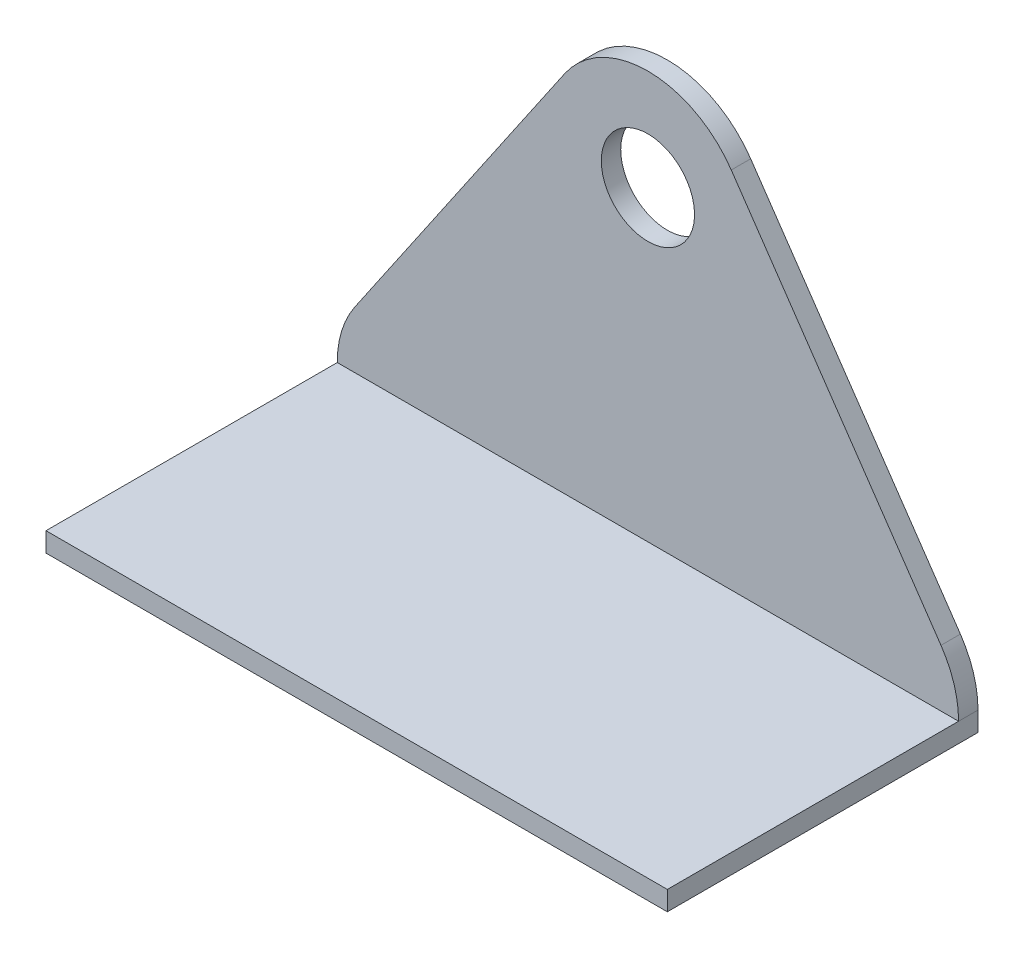
ISO-10303-21;
HEADER;
FILE_DESCRIPTION(('STEP AP214'),'2;1');
FILE_NAME('part.step','',(''),(''),'','','');
FILE_SCHEMA(('AUTOMOTIVE_DESIGN { 1 0 10303 214 1 1 1 1 }'));
ENDSEC;
DATA;
#1=APPLICATION_CONTEXT('core data for automotive mechanical design processes');
#2=APPLICATION_PROTOCOL_DEFINITION('international standard','automotive_design',2000,#1);
#3=PRODUCT_CONTEXT('',#1,'mechanical');
#4=PRODUCT('Part','Part','',(#3));
#5=PRODUCT_RELATED_PRODUCT_CATEGORY('part','',(#4));
#6=PRODUCT_DEFINITION_FORMATION('','',#4);
#7=PRODUCT_DEFINITION_CONTEXT('part definition',#1,'design');
#8=PRODUCT_DEFINITION('design','',#6,#7);
#9=PRODUCT_DEFINITION_SHAPE('','',#8);
#10=(LENGTH_UNIT() NAMED_UNIT(*) SI_UNIT(.MILLI.,.METRE.));
#11=(NAMED_UNIT(*) PLANE_ANGLE_UNIT() SI_UNIT($,.RADIAN.));
#12=(NAMED_UNIT(*) SI_UNIT($,.STERADIAN.) SOLID_ANGLE_UNIT());
#13=UNCERTAINTY_MEASURE_WITH_UNIT(LENGTH_MEASURE(1.E-05),#10,'distance_accuracy_value','');
#14=(GEOMETRIC_REPRESENTATION_CONTEXT(3) GLOBAL_UNCERTAINTY_ASSIGNED_CONTEXT((#13)) GLOBAL_UNIT_ASSIGNED_CONTEXT((#10,
#11,#12)) REPRESENTATION_CONTEXT('',''));
#15=CARTESIAN_POINT('',(0.,0.,0.));
#16=DIRECTION('',(0.,0.,1.));
#17=DIRECTION('',(1.,0.,0.));
#18=AXIS2_PLACEMENT_3D('',#15,#16,#17);
#19=CARTESIAN_POINT('',(0.,2.5,-40.));
#20=DIRECTION('',(0.,-1.,0.));
#21=DIRECTION('',(0.,0.,-1.));
#22=AXIS2_PLACEMENT_3D('',#19,#20,#21);
#23=PLANE('',#22);
#24=DIRECTION('',(1.,0.,0.));
#25=VECTOR('',#24,1.);
#26=CARTESIAN_POINT('',(-44.5033848530159,2.5,-37.5));
#27=LINE('',#26,#25);
#28=CARTESIAN_POINT('',(0.,2.5,-37.5));
#29=VERTEX_POINT('',#28);
#30=CARTESIAN_POINT('',(80.,2.5,-37.5));
#31=VERTEX_POINT('',#30);
#32=EDGE_CURVE('E59',#29,#31,#27,.T.);
#33=ORIENTED_EDGE('',*,*,#32,.F.);
#34=DIRECTION('',(0.,0.,1.));
#35=VECTOR('',#34,1.);
#36=CARTESIAN_POINT('',(0.,2.5,0.));
#37=LINE('',#36,#35);
#38=CARTESIAN_POINT('',(0.,2.5,0.));
#39=VERTEX_POINT('',#38);
#40=EDGE_CURVE('E93',#29,#39,#37,.T.);
#41=ORIENTED_EDGE('',*,*,#40,.T.);
#42=DIRECTION('',(1.,0.,0.));
#43=VECTOR('',#42,1.);
#44=CARTESIAN_POINT('',(0.,2.5,0.));
#45=LINE('',#44,#43);
#46=CARTESIAN_POINT('',(80.,2.5,0.));
#47=VERTEX_POINT('',#46);
#48=EDGE_CURVE('E201',#39,#47,#45,.T.);
#49=ORIENTED_EDGE('',*,*,#48,.T.);
#50=DIRECTION('',(0.,0.,-1.));
#51=VECTOR('',#50,1.);
#52=CARTESIAN_POINT('',(80.,2.5,0.));
#53=LINE('',#52,#51);
#54=EDGE_CURVE('E208',#47,#31,#53,.T.);
#55=ORIENTED_EDGE('',*,*,#54,.T.);
#56=EDGE_LOOP('',(#33,#41,#49,#55));
#57=FACE_BOUND('',#56,.T.);
#58=ADVANCED_FACE('F39',(#57),#23,.F.);
#59=CARTESIAN_POINT('',(0.,2.5,0.));
#60=DIRECTION('',(1.,0.,0.));
#61=DIRECTION('',(0.,0.,-1.));
#62=AXIS2_PLACEMENT_3D('',#59,#60,#61);
#63=PLANE('',#62);
#64=DIRECTION('',(0.,0.,1.));
#65=VECTOR('',#64,1.);
#66=CARTESIAN_POINT('',(0.,0.,0.));
#67=LINE('',#66,#65);
#68=CARTESIAN_POINT('',(0.,0.,-40.));
#69=VERTEX_POINT('',#68);
#70=CARTESIAN_POINT('',(0.,0.,0.));
#71=VERTEX_POINT('',#70);
#72=EDGE_CURVE('E162',#69,#71,#67,.T.);
#73=ORIENTED_EDGE('',*,*,#72,.T.);
#74=DIRECTION('',(0.,-1.,0.));
#75=VECTOR('',#74,1.);
#76=CARTESIAN_POINT('',(0.,2.5,0.));
#77=LINE('',#76,#75);
#78=EDGE_CURVE('E11',#39,#71,#77,.T.);
#79=ORIENTED_EDGE('',*,*,#78,.F.);
#80=ORIENTED_EDGE('',*,*,#40,.F.);
#81=CARTESIAN_POINT('',(0.,2.5,-40.));
#82=VERTEX_POINT('',#81);
#83=EDGE_CURVE('E151',#82,#29,#37,.T.);
#84=ORIENTED_EDGE('',*,*,#83,.F.);
#85=DIRECTION('',(0.,-1.,0.));
#86=VECTOR('',#85,1.);
#87=CARTESIAN_POINT('',(0.,2.5,-40.));
#88=LINE('',#87,#86);
#89=EDGE_CURVE('E69',#82,#69,#88,.T.);
#90=ORIENTED_EDGE('',*,*,#89,.T.);
#91=EDGE_LOOP('',(#73,#79,#80,#84,#90));
#92=FACE_BOUND('',#91,.T.);
#93=ADVANCED_FACE('F41',(#92),#63,.F.);
#94=CARTESIAN_POINT('',(0.,2.5,0.));
#95=DIRECTION('',(0.,0.,-1.));
#96=DIRECTION('',(-1.,0.,0.));
#97=AXIS2_PLACEMENT_3D('',#94,#95,#96);
#98=PLANE('',#97);
#99=DIRECTION('',(1.,0.,0.));
#100=VECTOR('',#99,1.);
#101=CARTESIAN_POINT('',(0.,0.,0.));
#102=LINE('',#101,#100);
#103=CARTESIAN_POINT('',(80.,0.,0.));
#104=VERTEX_POINT('',#103);
#105=EDGE_CURVE('E214',#71,#104,#102,.T.);
#106=ORIENTED_EDGE('',*,*,#105,.T.);
#107=DIRECTION('',(0.,-1.,0.));
#108=VECTOR('',#107,1.);
#109=CARTESIAN_POINT('',(80.,2.5,0.));
#110=LINE('',#109,#108);
#111=EDGE_CURVE('E48',#47,#104,#110,.T.);
#112=ORIENTED_EDGE('',*,*,#111,.F.);
#113=ORIENTED_EDGE('',*,*,#48,.F.);
#114=ORIENTED_EDGE('',*,*,#78,.T.);
#115=EDGE_LOOP('',(#106,#112,#113,#114));
#116=FACE_BOUND('',#115,.T.);
#117=ADVANCED_FACE('F264',(#116),#98,.F.);
#118=CARTESIAN_POINT('',(80.,2.5,0.));
#119=DIRECTION('',(-1.,0.,0.));
#120=DIRECTION('',(0.,0.,1.));
#121=AXIS2_PLACEMENT_3D('',#118,#119,#120);
#122=PLANE('',#121);
#123=DIRECTION('',(0.,0.,-1.));
#124=VECTOR('',#123,1.);
#125=CARTESIAN_POINT('',(80.,0.,0.));
#126=LINE('',#125,#124);
#127=CARTESIAN_POINT('',(80.,0.,-40.));
#128=VERTEX_POINT('',#127);
#129=EDGE_CURVE('E216',#104,#128,#126,.T.);
#130=ORIENTED_EDGE('',*,*,#129,.T.);
#131=DIRECTION('',(0.,-1.,0.));
#132=VECTOR('',#131,1.);
#133=CARTESIAN_POINT('',(80.,2.5,-40.));
#134=LINE('',#133,#132);
#135=CARTESIAN_POINT('',(80.,2.5,-40.));
#136=VERTEX_POINT('',#135);
#137=EDGE_CURVE('E220',#136,#128,#134,.T.);
#138=ORIENTED_EDGE('',*,*,#137,.F.);
#139=DIRECTION('',(0.,0.,-1.));
#140=VECTOR('',#139,1.);
#141=CARTESIAN_POINT('',(80.,2.5,-37.5));
#142=LINE('',#141,#140);
#143=EDGE_CURVE('E160',#31,#136,#142,.T.);
#144=ORIENTED_EDGE('',*,*,#143,.F.);
#145=ORIENTED_EDGE('',*,*,#54,.F.);
#146=ORIENTED_EDGE('',*,*,#111,.T.);
#147=EDGE_LOOP('',(#130,#138,#144,#145,#146));
#148=FACE_BOUND('',#147,.T.);
#149=ADVANCED_FACE('F227',(#148),#122,.F.);
#150=CARTESIAN_POINT('',(0.,2.5,-40.));
#151=DIRECTION('',(0.,0.,1.));
#152=DIRECTION('',(1.,0.,0.));
#153=AXIS2_PLACEMENT_3D('',#150,#151,#152);
#154=PLANE('',#153);
#155=DIRECTION('',(-1.,0.,0.));
#156=VECTOR('',#155,1.);
#157=CARTESIAN_POINT('',(0.,0.,-40.));
#158=LINE('',#157,#156);
#159=EDGE_CURVE('E90',#128,#69,#158,.T.);
#160=ORIENTED_EDGE('',*,*,#159,.T.);
#161=ORIENTED_EDGE('',*,*,#89,.F.);
#162=CARTESIAN_POINT('',(13.,2.5,-40.));
#163=DIRECTION('',(0.,0.,-1.));
#164=DIRECTION('',(-1.,0.,0.));
#165=AXIS2_PLACEMENT_3D('',#162,#163,#164);
#166=CIRCLE('',#165,13.);
#167=CARTESIAN_POINT('',(2.26767448479644,9.83601997241763,-40.));
#168=VERTEX_POINT('',#167);
#169=EDGE_CURVE('E179',#82,#168,#166,.T.);
#170=ORIENTED_EDGE('',*,*,#169,.T.);
#171=DIRECTION('',(0.56430922864751,0.825563501169506,0.));
#172=VECTOR('',#171,1.);
#173=CARTESIAN_POINT('',(-11.5455002916758,-10.3721431264954,-40.));
#174=LINE('',#173,#172);
#175=CARTESIAN_POINT('',(29.2676744847964,49.3360199724176,-40.));
#176=VERTEX_POINT('',#175);
#177=EDGE_CURVE('E132',#168,#176,#174,.T.);
#178=ORIENTED_EDGE('',*,*,#177,.T.);
#179=CARTESIAN_POINT('',(40.,42.,-40.));
#180=DIRECTION('',(0.,0.,-1.));
#181=DIRECTION('',(-1.,0.,0.));
#182=AXIS2_PLACEMENT_3D('',#179,#180,#181);
#183=CIRCLE('',#182,13.);
#184=CARTESIAN_POINT('',(50.7323255152036,49.3360199724176,-40.));
#185=VERTEX_POINT('',#184);
#186=EDGE_CURVE('E183',#185,#176,#183,.F.);
#187=ORIENTED_EDGE('',*,*,#186,.F.);
#188=DIRECTION('',(-0.56430922864751,0.825563501169506,0.));
#189=VECTOR('',#188,1.);
#190=CARTESIAN_POINT('',(37.7261554775676,68.3635650274776,-40.));
#191=LINE('',#190,#189);
#192=CARTESIAN_POINT('',(77.7323255152036,9.83601997241763,-40.));
#193=VERTEX_POINT('',#192);
#194=EDGE_CURVE('E187',#193,#185,#191,.T.);
#195=ORIENTED_EDGE('',*,*,#194,.F.);
#196=CARTESIAN_POINT('',(67.,2.5,-40.));
#197=DIRECTION('',(0.,0.,-1.));
#198=DIRECTION('',(-1.,0.,0.));
#199=AXIS2_PLACEMENT_3D('',#196,#197,#198);
#200=CIRCLE('',#199,13.);
#201=EDGE_CURVE('E189',#136,#193,#200,.F.);
#202=ORIENTED_EDGE('',*,*,#201,.F.);
#203=ORIENTED_EDGE('',*,*,#137,.T.);
#204=EDGE_LOOP('',(#160,#161,#170,#178,#187,#195,#202,#203));
#205=FACE_BOUND('',#204,.T.);
#206=CARTESIAN_POINT('',(40.,42.,-40.));
#207=DIRECTION('',(0.,0.,-1.));
#208=DIRECTION('',(-1.,0.,0.));
#209=AXIS2_PLACEMENT_3D('',#206,#207,#208);
#210=CIRCLE('',#209,5.99999999999999);
#211=CARTESIAN_POINT('',(34.,42.,-40.));
#212=VERTEX_POINT('',#211);
#213=EDGE_CURVE('E175',#212,#212,#210,.T.);
#214=ORIENTED_EDGE('',*,*,#213,.F.);
#215=EDGE_LOOP('',(#214));
#216=FACE_BOUND('',#215,.T.);
#217=ADVANCED_FACE('F235',(#205,#216),#154,.F.);
#218=CARTESIAN_POINT('',(0.,0.,-40.));
#219=DIRECTION('',(0.,-1.,0.));
#220=DIRECTION('',(0.,0.,-1.));
#221=AXIS2_PLACEMENT_3D('',#218,#219,#220);
#222=PLANE('',#221);
#223=ORIENTED_EDGE('',*,*,#72,.F.);
#224=ORIENTED_EDGE('',*,*,#159,.F.);
#225=ORIENTED_EDGE('',*,*,#129,.F.);
#226=ORIENTED_EDGE('',*,*,#105,.F.);
#227=EDGE_LOOP('',(#223,#224,#225,#226));
#228=FACE_BOUND('',#227,.T.);
#229=ADVANCED_FACE('F232',(#228),#222,.T.);
#230=CARTESIAN_POINT('',(67.,2.5,-37.5));
#231=DIRECTION('',(0.,0.,-1.));
#232=DIRECTION('',(-1.,0.,0.));
#233=AXIS2_PLACEMENT_3D('',#230,#231,#232);
#234=CYLINDRICAL_SURFACE('',#233,13.);
#235=ORIENTED_EDGE('',*,*,#201,.T.);
#236=DIRECTION('',(0.,0.,-1.));
#237=VECTOR('',#236,1.);
#238=CARTESIAN_POINT('',(77.7323255152036,9.83601997241763,-37.5));
#239=LINE('',#238,#237);
#240=CARTESIAN_POINT('',(77.7323255152036,9.83601997241763,-37.5));
#241=VERTEX_POINT('',#240);
#242=EDGE_CURVE('E163',#241,#193,#239,.T.);
#243=ORIENTED_EDGE('',*,*,#242,.F.);
#244=CARTESIAN_POINT('',(67.,2.5,-37.5));
#245=DIRECTION('',(0.,0.,-1.));
#246=DIRECTION('',(-1.,0.,0.));
#247=AXIS2_PLACEMENT_3D('',#244,#245,#246);
#248=CIRCLE('',#247,13.);
#249=EDGE_CURVE('E138',#31,#241,#248,.F.);
#250=ORIENTED_EDGE('',*,*,#249,.F.);
#251=ORIENTED_EDGE('',*,*,#143,.T.);
#252=EDGE_LOOP('',(#235,#243,#250,#251));
#253=FACE_BOUND('',#252,.T.);
#254=ADVANCED_FACE('F249',(#253),#234,.T.);
#255=CARTESIAN_POINT('',(37.7261554775676,68.3635650274776,-37.5));
#256=DIRECTION('',(-0.825563501169506,-0.56430922864751,0.));
#257=DIRECTION('',(0.56430922864751,-0.825563501169506,0.));
#258=AXIS2_PLACEMENT_3D('',#255,#256,#257);
#259=PLANE('',#258);
#260=ORIENTED_EDGE('',*,*,#194,.T.);
#261=DIRECTION('',(0.,0.,-1.));
#262=VECTOR('',#261,1.);
#263=CARTESIAN_POINT('',(50.7323255152036,49.3360199724176,-37.5));
#264=LINE('',#263,#262);
#265=CARTESIAN_POINT('',(50.7323255152036,49.3360199724176,-37.5));
#266=VERTEX_POINT('',#265);
#267=EDGE_CURVE('E193',#266,#185,#264,.T.);
#268=ORIENTED_EDGE('',*,*,#267,.F.);
#269=DIRECTION('',(-0.56430922864751,0.825563501169506,0.));
#270=VECTOR('',#269,1.);
#271=CARTESIAN_POINT('',(37.7261554775676,68.3635650274776,-37.5));
#272=LINE('',#271,#270);
#273=EDGE_CURVE('E173',#241,#266,#272,.T.);
#274=ORIENTED_EDGE('',*,*,#273,.F.);
#275=ORIENTED_EDGE('',*,*,#242,.T.);
#276=EDGE_LOOP('',(#260,#268,#274,#275));
#277=FACE_BOUND('',#276,.T.);
#278=ADVANCED_FACE('F245',(#277),#259,.F.);
#279=CARTESIAN_POINT('',(40.,42.,-37.5));
#280=DIRECTION('',(0.,0.,-1.));
#281=DIRECTION('',(-1.,0.,0.));
#282=AXIS2_PLACEMENT_3D('',#279,#280,#281);
#283=CYLINDRICAL_SURFACE('',#282,13.);
#284=ORIENTED_EDGE('',*,*,#186,.T.);
#285=DIRECTION('',(0.,0.,-1.));
#286=VECTOR('',#285,1.);
#287=CARTESIAN_POINT('',(29.2676744847964,49.3360199724176,-37.5));
#288=LINE('',#287,#286);
#289=CARTESIAN_POINT('',(29.2676744847964,49.3360199724176,-37.5));
#290=VERTEX_POINT('',#289);
#291=EDGE_CURVE('E137',#290,#176,#288,.T.);
#292=ORIENTED_EDGE('',*,*,#291,.F.);
#293=CARTESIAN_POINT('',(40.,42.,-37.5));
#294=DIRECTION('',(0.,0.,-1.));
#295=DIRECTION('',(-1.,0.,0.));
#296=AXIS2_PLACEMENT_3D('',#293,#294,#295);
#297=CIRCLE('',#296,13.);
#298=EDGE_CURVE('E145',#266,#290,#297,.F.);
#299=ORIENTED_EDGE('',*,*,#298,.F.);
#300=ORIENTED_EDGE('',*,*,#267,.T.);
#301=EDGE_LOOP('',(#284,#292,#299,#300));
#302=FACE_BOUND('',#301,.T.);
#303=ADVANCED_FACE('F241',(#302),#283,.T.);
#304=CARTESIAN_POINT('',(-11.5455002916758,-10.3721431264954,-37.5));
#305=DIRECTION('',(-0.825563501169506,0.56430922864751,0.));
#306=DIRECTION('',(-0.56430922864751,-0.825563501169506,0.));
#307=AXIS2_PLACEMENT_3D('',#304,#305,#306);
#308=PLANE('',#307);
#309=ORIENTED_EDGE('',*,*,#177,.F.);
#310=DIRECTION('',(0.,0.,-1.));
#311=VECTOR('',#310,1.);
#312=CARTESIAN_POINT('',(2.26767448479644,9.83601997241763,-37.5));
#313=LINE('',#312,#311);
#314=CARTESIAN_POINT('',(2.26767448479644,9.83601997241763,-37.5));
#315=VERTEX_POINT('',#314);
#316=EDGE_CURVE('E127',#315,#168,#313,.T.);
#317=ORIENTED_EDGE('',*,*,#316,.F.);
#318=DIRECTION('',(0.56430922864751,0.825563501169506,0.));
#319=VECTOR('',#318,1.);
#320=CARTESIAN_POINT('',(-11.5455002916758,-10.3721431264954,-37.5));
#321=LINE('',#320,#319);
#322=EDGE_CURVE('E130',#315,#290,#321,.T.);
#323=ORIENTED_EDGE('',*,*,#322,.T.);
#324=ORIENTED_EDGE('',*,*,#291,.T.);
#325=EDGE_LOOP('',(#309,#317,#323,#324));
#326=FACE_BOUND('',#325,.T.);
#327=ADVANCED_FACE('F129',(#326),#308,.T.);
#328=CARTESIAN_POINT('',(40.,42.,-37.5));
#329=DIRECTION('',(0.,0.,-1.));
#330=DIRECTION('',(-1.,0.,0.));
#331=AXIS2_PLACEMENT_3D('',#328,#329,#330);
#332=CYLINDRICAL_SURFACE('',#331,5.99999999999999);
#333=CARTESIAN_POINT('',(40.,42.,-37.5));
#334=DIRECTION('',(0.,0.,-1.));
#335=DIRECTION('',(-1.,0.,0.));
#336=AXIS2_PLACEMENT_3D('',#333,#334,#335);
#337=CIRCLE('',#336,5.99999999999999);
#338=CARTESIAN_POINT('',(34.,42.,-37.5));
#339=VERTEX_POINT('',#338);
#340=EDGE_CURVE('E155',#339,#339,#337,.T.);
#341=ORIENTED_EDGE('',*,*,#340,.F.);
#342=EDGE_LOOP('',(#341));
#343=FACE_BOUND('',#342,.T.);
#344=ORIENTED_EDGE('',*,*,#213,.T.);
#345=EDGE_LOOP('',(#344));
#346=FACE_BOUND('',#345,.T.);
#347=ADVANCED_FACE('F266',(#343,#346),#332,.F.);
#348=CARTESIAN_POINT('',(13.,2.5,-37.5));
#349=DIRECTION('',(0.,0.,-1.));
#350=DIRECTION('',(-1.,0.,0.));
#351=AXIS2_PLACEMENT_3D('',#348,#349,#350);
#352=CYLINDRICAL_SURFACE('',#351,13.);
#353=ORIENTED_EDGE('',*,*,#169,.F.);
#354=ORIENTED_EDGE('',*,*,#83,.T.);
#355=CARTESIAN_POINT('',(13.,2.5,-37.5));
#356=DIRECTION('',(0.,0.,-1.));
#357=DIRECTION('',(-1.,0.,0.));
#358=AXIS2_PLACEMENT_3D('',#355,#356,#357);
#359=CIRCLE('',#358,13.);
#360=EDGE_CURVE('E143',#29,#315,#359,.T.);
#361=ORIENTED_EDGE('',*,*,#360,.T.);
#362=ORIENTED_EDGE('',*,*,#316,.T.);
#363=EDGE_LOOP('',(#353,#354,#361,#362));
#364=FACE_BOUND('',#363,.T.);
#365=ADVANCED_FACE('F150',(#364),#352,.T.);
#366=CARTESIAN_POINT('',(-44.5033848530159,12.1560311306231,-37.5));
#367=DIRECTION('',(0.,0.,-1.));
#368=DIRECTION('',(-1.,0.,0.));
#369=AXIS2_PLACEMENT_3D('',#366,#367,#368);
#370=PLANE('',#369);
#371=ORIENTED_EDGE('',*,*,#340,.T.);
#372=EDGE_LOOP('',(#371));
#373=FACE_BOUND('',#372,.T.);
#374=ORIENTED_EDGE('',*,*,#32,.T.);
#375=ORIENTED_EDGE('',*,*,#249,.T.);
#376=ORIENTED_EDGE('',*,*,#273,.T.);
#377=ORIENTED_EDGE('',*,*,#298,.T.);
#378=ORIENTED_EDGE('',*,*,#322,.F.);
#379=ORIENTED_EDGE('',*,*,#360,.F.);
#380=EDGE_LOOP('',(#374,#375,#376,#377,#378,#379));
#381=FACE_BOUND('',#380,.T.);
#382=ADVANCED_FACE('F142',(#373,#381),#370,.F.);
#383=CLOSED_SHELL('',(#58,#93,#117,#149,#217,#229,#254,#278,#303,#327,#347,#365,#382));
#384=MANIFOLD_SOLID_BREP('B2',#383);
#385=ADVANCED_BREP_SHAPE_REPRESENTATION('',(#18,#384),#14);
#386=SHAPE_DEFINITION_REPRESENTATION(#9,#385);
ENDSEC;
END-ISO-10303-21;
